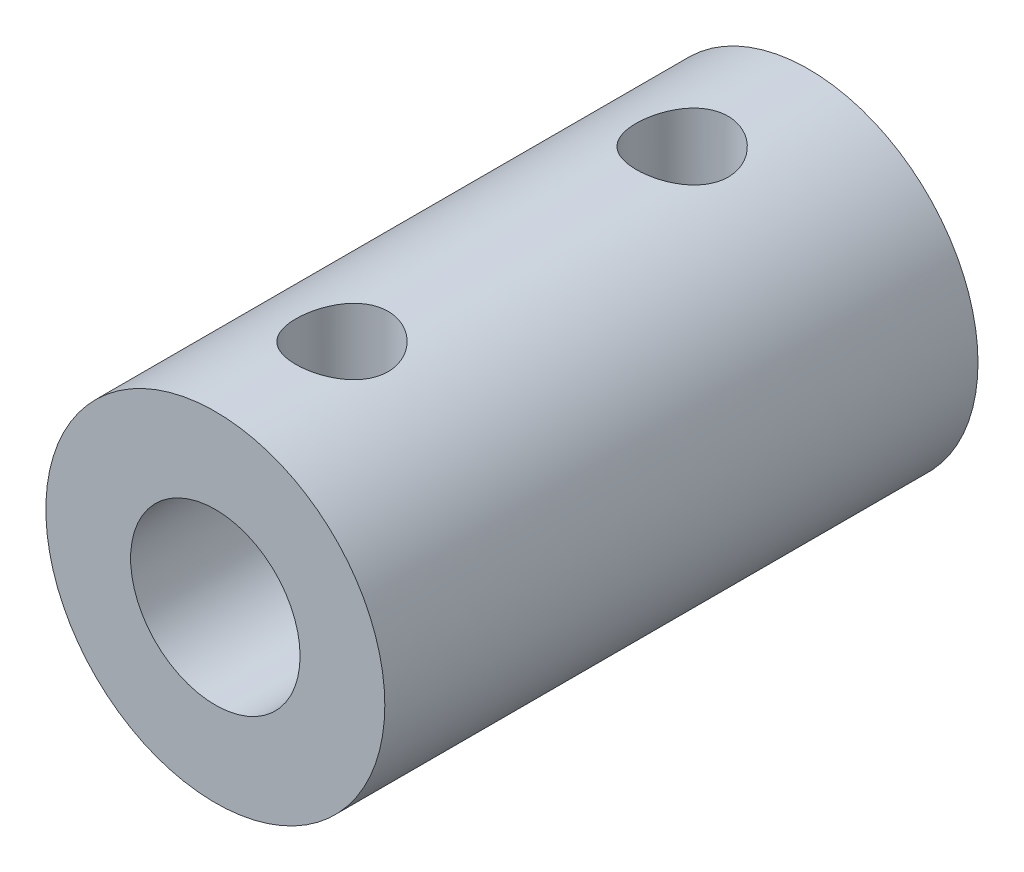
ISO-10303-21;
HEADER;
FILE_DESCRIPTION(('STEP AP214'),'2;1');
FILE_NAME('part.step','',(''),(''),'','','');
FILE_SCHEMA(('AUTOMOTIVE_DESIGN { 1 0 10303 214 1 1 1 1 }'));
ENDSEC;
DATA;
#1=APPLICATION_CONTEXT('core data for automotive mechanical design processes');
#2=APPLICATION_PROTOCOL_DEFINITION('international standard','automotive_design',2000,#1);
#3=PRODUCT_CONTEXT('',#1,'mechanical');
#4=PRODUCT('Part','Part','',(#3));
#5=PRODUCT_RELATED_PRODUCT_CATEGORY('part','',(#4));
#6=PRODUCT_DEFINITION_FORMATION('','',#4);
#7=PRODUCT_DEFINITION_CONTEXT('part definition',#1,'design');
#8=PRODUCT_DEFINITION('design','',#6,#7);
#9=PRODUCT_DEFINITION_SHAPE('','',#8);
#10=(LENGTH_UNIT() NAMED_UNIT(*) SI_UNIT(.MILLI.,.METRE.));
#11=(NAMED_UNIT(*) PLANE_ANGLE_UNIT() SI_UNIT($,.RADIAN.));
#12=(NAMED_UNIT(*) SI_UNIT($,.STERADIAN.) SOLID_ANGLE_UNIT());
#13=UNCERTAINTY_MEASURE_WITH_UNIT(LENGTH_MEASURE(1.E-05),#10,'distance_accuracy_value','');
#14=(GEOMETRIC_REPRESENTATION_CONTEXT(3) GLOBAL_UNCERTAINTY_ASSIGNED_CONTEXT((#13)) GLOBAL_UNIT_ASSIGNED_CONTEXT((#10,
#11,#12)) REPRESENTATION_CONTEXT('',''));
#15=CARTESIAN_POINT('',(0.,0.,0.));
#16=DIRECTION('',(0.,0.,1.));
#17=DIRECTION('',(1.,0.,0.));
#18=AXIS2_PLACEMENT_3D('',#15,#16,#17);
#19=CARTESIAN_POINT('',(0.,0.,22.225));
#20=DIRECTION('',(0.,0.,-1.));
#21=DIRECTION('',(-1.,0.,0.));
#22=AXIS2_PLACEMENT_3D('',#19,#20,#21);
#23=CYLINDRICAL_SURFACE('',#22,6.35);
#24=CARTESIAN_POINT('',(-1.74415507928932,6.10576965331884,17.4625));
#25=CARTESIAN_POINT('',(-1.74415294015703,6.10577123313325,17.3674284577655));
#26=CARTESIAN_POINT('',(-1.73628495695863,6.1080345239605,17.2723345348167));
#27=CARTESIAN_POINT('',(-1.70508323702834,6.11681659763782,17.0848981821488));
#28=CARTESIAN_POINT('',(-1.68174214778818,6.12333740355106,16.9925570823245));
#29=CARTESIAN_POINT('',(-1.62042086431407,6.13984813147446,16.8133651623767));
#30=CARTESIAN_POINT('',(-1.58246182034459,6.14983303932412,16.7265066200726));
#31=CARTESIAN_POINT('',(-1.49304666511393,6.17214925070533,16.5603804050019));
#32=CARTESIAN_POINT('',(-1.44158935107507,6.18448076330667,16.4811134095479));
#33=CARTESIAN_POINT('',(-1.32520352981619,6.21047218741606,16.3303578995175));
#34=CARTESIAN_POINT('',(-1.25998666512871,6.22415651988476,16.259096164451));
#35=CARTESIAN_POINT('',(-1.11854925756673,6.25112170803639,16.1283810792449));
#36=CARTESIAN_POINT('',(-1.04232753621755,6.26440252032305,16.0689289953849));
#37=CARTESIAN_POINT('',(-0.879463006344653,6.28935080737628,15.9625692349372));
#38=CARTESIAN_POINT('',(-0.792667279196146,6.300987597913,15.9158878961916));
#39=CARTESIAN_POINT('',(-0.612088846478514,6.32108276451823,15.8378723300576));
#40=CARTESIAN_POINT('',(-0.518307371907505,6.32954169899454,15.8065354060792));
#41=CARTESIAN_POINT('',(-0.328785161811779,6.34217640045183,15.7608346862393));
#42=CARTESIAN_POINT('',(-0.233144081342569,6.34644925676441,15.7460849141064));
#43=CARTESIAN_POINT('',(-0.0406545553170849,6.35059899504887,15.7327619063127));
#44=CARTESIAN_POINT('',(0.056193677387739,6.35047664134565,15.7341858580196));
#45=CARTESIAN_POINT('',(0.24565829208822,6.34593589511195,15.7529000073959));
#46=CARTESIAN_POINT('',(0.338319042579959,6.34163027244158,15.7697730515847));
#47=CARTESIAN_POINT('',(0.51945101677674,6.32936931428713,15.8182313557966));
#48=CARTESIAN_POINT('',(0.607921996536334,6.32141376657714,15.849817471317));
#49=CARTESIAN_POINT('',(0.779215251149414,6.30260505365105,15.927119217789));
#50=CARTESIAN_POINT('',(0.861970551792002,6.2917231043366,15.9729759601303));
#51=CARTESIAN_POINT('',(1.01875750709587,6.26824751559683,16.0774084842002));
#52=CARTESIAN_POINT('',(1.09278739768205,6.25565353114231,16.1359868311599));
#53=CARTESIAN_POINT('',(1.2325108050718,6.22965758580126,16.2664066554296));
#54=CARTESIAN_POINT('',(1.29786298931935,6.21624266620785,16.3386116667761));
#55=CARTESIAN_POINT('',(1.41561375879274,6.19049114815906,16.4930898873093));
#56=CARTESIAN_POINT('',(1.46801148682996,6.17815462109516,16.5753637622084));
#57=CARTESIAN_POINT('',(1.55863719890032,6.15592004886759,16.7484083218315));
#58=CARTESIAN_POINT('',(1.59676878377281,6.14603873946286,16.8392317988796));
#59=CARTESIAN_POINT('',(1.65709770241316,6.1300499257148,17.0263359521683));
#60=CARTESIAN_POINT('',(1.67929917222809,6.1239414418638,17.122615204878));
#61=CARTESIAN_POINT('',(1.70653964336872,6.11640559637245,17.3146965805924));
#62=CARTESIAN_POINT('',(1.71208974320032,6.11483888183383,17.4104208318607));
#63=CARTESIAN_POINT('',(1.70728066099863,6.11618339918588,17.6014296145391));
#64=CARTESIAN_POINT('',(1.69692325027692,6.11909413250989,17.6967141937221));
#65=CARTESIAN_POINT('',(1.66104520801374,6.12892808816301,17.882146878432));
#66=CARTESIAN_POINT('',(1.635835087284,6.13576907382831,17.9723598597757));
#67=CARTESIAN_POINT('',(1.57131960699209,6.1526058706512,18.1472792656851));
#68=CARTESIAN_POINT('',(1.53201235235506,6.16260210594668,18.2319849480962));
#69=CARTESIAN_POINT('',(1.43939369004808,6.18489751515275,18.3956129044187));
#70=CARTESIAN_POINT('',(1.38578405693559,6.19724390344623,18.4743597850867));
#71=CARTESIAN_POINT('',(1.26645274036601,6.22272549947527,18.6219330292905));
#72=CARTESIAN_POINT('',(1.2007286847128,6.23586086136418,18.6907574451383));
#73=CARTESIAN_POINT('',(1.05666768755968,6.26190556861521,18.8186693227853));
#74=CARTESIAN_POINT('',(0.978009624288813,6.27479608994583,18.8773997077894));
#75=CARTESIAN_POINT('',(0.811661552302276,6.298472263292,18.9808308667717));
#76=CARTESIAN_POINT('',(0.723972024562248,6.30925802730912,19.0255323873523));
#77=CARTESIAN_POINT('',(0.542669728911745,6.32741951415227,19.0992209519507));
#78=CARTESIAN_POINT('',(0.449107667042275,6.33482080929817,19.1283261362846));
#79=CARTESIAN_POINT('',(0.258191290701053,6.34546815392449,19.1703338741575));
#80=CARTESIAN_POINT('',(0.16083785862134,6.34871516437541,19.1832401748144));
#81=CARTESIAN_POINT('',(-0.0315666969252643,6.35062727375499,19.1922411873145));
#82=CARTESIAN_POINT('',(-0.126592283322449,6.34943513392035,19.1888586987469));
#83=CARTESIAN_POINT('',(-0.314657376033977,6.34289714735773,19.1665975149432));
#84=CARTESIAN_POINT('',(-0.40769696220342,6.33755146796392,19.1477194439778));
#85=CARTESIAN_POINT('',(-0.588494518781807,6.32331749363553,19.0953032896412));
#86=CARTESIAN_POINT('',(-0.67628656708008,6.31445578918089,19.0618750639996));
#87=CARTESIAN_POINT('',(-0.845058015947138,6.29409332100137,18.9814053612947));
#88=CARTESIAN_POINT('',(-0.926036429769152,6.28259217593006,18.9343619168476));
#89=CARTESIAN_POINT('',(-1.08130175142431,6.25776660403122,18.826488376609));
#90=CARTESIAN_POINT('',(-1.15534309950238,6.24440070229572,18.7653144197219));
#91=CARTESIAN_POINT('',(-1.29228502025197,6.21750591720152,18.6315634185813));
#92=CARTESIAN_POINT('',(-1.35518261662916,6.20397699132936,18.5589833376961));
#93=CARTESIAN_POINT('',(-1.46949902297096,6.17791203327205,18.4024605102873));
#94=CARTESIAN_POINT('',(-1.52061855731867,6.16540621829478,18.3182937079649));
#95=CARTESIAN_POINT('',(-1.60791768912795,6.14321925242848,18.1422283690047));
#96=CARTESIAN_POINT('',(-1.64410668099876,6.13353632648532,18.0503347381026));
#97=CARTESIAN_POINT('',(-1.69600282262268,6.1193690565194,17.8761202752871));
#98=CARTESIAN_POINT('',(-1.71401654666183,6.11431124936343,17.7945261216434));
#99=CARTESIAN_POINT('',(-1.73809286747036,6.10751106126085,17.6294602411976));
#100=CARTESIAN_POINT('',(-1.74415695780605,6.10576826597697,17.5459887503602));
#101=CARTESIAN_POINT('',(-1.74415507928932,6.10576965331884,17.4625));
#102=B_SPLINE_CURVE_WITH_KNOTS('',3,(#24,#25,#26,#27,#28,#29,#30,#31,#32,#33,#34,#35,#36,#37,
#38,#39,#40,#41,#42,#43,#44,#45,#46,#47,#48,#49,#50,#51,#52,#53,#54,#55,#56,#57,#58,#59,#60,#61,
#62,#63,#64,#65,#66,#67,#68,#69,#70,#71,#72,#73,#74,#75,#76,#77,#78,#79,#80,#81,#82,#83,#84,#85,
#86,#87,#88,#89,#90,#91,#92,#93,#94,#95,#96,#97,#98,#99,#100,#101),.UNSPECIFIED.,.T.,.F.,(4,2,2,
2,2,2,2,2,2,2,2,2,2,2,2,2,2,2,2,2,2,2,2,2,2,2,2,2,2,2,2,2,2,2,2,2,2,2,4),(0.,0.284907483795322,
0.569950447023162,0.854582530633478,1.13923998530775,1.4305920860604,1.72197540994495,
2.01823016220199,2.31443283266957,2.60359035057114,2.89269758436284,3.17422149638734,
3.45576177977405,3.74017954811614,4.02465472083983,4.31820614748809,4.6117769930633,
4.90729718589529,5.20274062296329,5.48901787200055,5.775263246192,6.05572669321374,
6.33622785702082,6.62310984645767,6.91004807173361,7.20565699731883,7.50125018821925,
7.79457145824388,8.08782486482188,8.37173002674299,8.6556237515334,8.93741020430449,
9.21923739524772,9.50882250475626,9.79848484099475,10.0948495083034,10.3910274153003,
10.641255220995,10.8914517491176),.UNSPECIFIED.);
#103=CARTESIAN_POINT('',(-1.74415507928932,6.10576965331884,17.4625));
#104=VERTEX_POINT('',#103);
#105=EDGE_CURVE('E107',#104,#104,#102,.T.);
#106=ORIENTED_EDGE('',*,*,#105,.T.);
#107=EDGE_LOOP('',(#106));
#108=FACE_BOUND('',#107,.T.);
#109=CARTESIAN_POINT('',(-1.70001586687602,6.11820611391687,4.7625));
#110=CARTESIAN_POINT('',(-1.70001371639064,6.11820767824203,4.66742845776545));
#111=CARTESIAN_POINT('',(-1.69212959366727,6.1204140902303,4.57233453481675));
#112=CARTESIAN_POINT('',(-1.66086526630538,6.1289706070035,4.38489818214883));
#113=CARTESIAN_POINT('',(-1.63747769474044,6.1353226817016,4.29255708232449));
#114=CARTESIAN_POINT('',(-1.57603877561068,6.15139013824081,4.11336516237671));
#115=CARTESIAN_POINT('',(-1.53800861396932,6.16110065879199,4.02650662007257));
#116=CARTESIAN_POINT('',(-1.44843463050231,6.18277056329537,3.86038040500195));
#117=CARTESIAN_POINT('',(-1.39688960442052,6.19473014762589,3.78111340954794));
#118=CARTESIAN_POINT('',(-1.28031911712485,6.21988039631233,3.63035789951748));
#119=CARTESIAN_POINT('',(-1.21500512960323,6.23309339857538,3.559096164451));
#120=CARTESIAN_POINT('',(-1.07337667707796,6.25903647212508,3.42838107924493));
#121=CARTESIAN_POINT('',(-0.997061033943764,6.27176649150605,3.36892899538489));
#122=CARTESIAN_POINT('',(-0.834020583204641,6.29553797737449,3.26256923493718));
#123=CARTESIAN_POINT('',(-0.747143082553263,6.30654765610746,3.21588789619164));
#124=CARTESIAN_POINT('',(-0.566424238422153,6.3253382244747,3.13787233005764));
#125=CARTESIAN_POINT('',(-0.472584121875812,6.33311968139204,3.10653540607917));
#126=CARTESIAN_POINT('',(-0.282975610456275,6.34438539032448,3.06083468623933));
#127=CARTESIAN_POINT('',(-0.187306166894769,6.34796744881334,3.04608491410639));
#128=CARTESIAN_POINT('',(0.00520830764368438,6.3507269869138,3.03276190631265));
#129=CARTESIAN_POINT('',(0.10205313129442,6.3499052323675,3.0341858580196));
#130=CARTESIAN_POINT('',(0.291480013749856,6.34399635741748,3.05290000739589));
#131=CARTESIAN_POINT('',(0.384107254278119,6.33902168351951,3.06977305158472));
#132=CARTESIAN_POINT('',(0.565145960847639,6.32545297337729,3.11823135579662));
#133=CARTESIAN_POINT('',(0.653557181417187,6.31685872667433,3.149817471317));
#134=CARTESIAN_POINT('',(0.824710139369087,6.29681348429136,3.22711921778902));
#135=CARTESIAN_POINT('',(0.90738469641831,6.28533418892786,3.27297596013029));
#136=CARTESIAN_POINT('',(1.06399803079042,6.26072695184226,3.3774084842002));
#137=CARTESIAN_POINT('',(1.13793504159252,6.24759867783949,3.43598683115992));
#138=CARTESIAN_POINT('',(1.27746707187424,6.2205943768443,3.56640665542959));
#139=CARTESIAN_POINT('',(1.34272067411533,6.20670785646716,3.6386116667761));
#140=CARTESIAN_POINT('',(1.46028240461751,6.18010665508966,3.7930898873093));
#141=CARTESIAN_POINT('',(1.51258967622789,6.16739205166925,3.87536376220845));
#142=CARTESIAN_POINT('',(1.60305245480392,6.14450359207259,4.04840832183152));
#143=CARTESIAN_POINT('',(1.64111168598245,6.13434716737986,4.13923179887965));
#144=CARTESIAN_POINT('',(1.70132356584273,6.11792309623186,4.32633595216835));
#145=CARTESIAN_POINT('',(1.72348034339003,6.11165444042535,4.42261520487799));
#146=CARTESIAN_POINT('',(1.75066568295766,6.10392207029543,4.61469658059239));
#147=CARTESIAN_POINT('',(1.75620432379839,6.10231531573307,4.71042083186068));
#148=CARTESIAN_POINT('',(1.75140507663415,6.10369452753305,4.90142961453912));
#149=CARTESIAN_POINT('',(1.74106895629412,6.10667998254995,4.9967141937221));
#150=CARTESIAN_POINT('',(1.70526286698828,6.11677278043003,5.18214687843204));
#151=CARTESIAN_POINT('',(1.68010280685279,6.12379564637348,5.27235985977574));
#152=CARTESIAN_POINT('',(1.61571059834855,6.14109791236661,5.44727926568507));
#153=CARTESIAN_POINT('',(1.57647655801732,6.1513777502287,5.53198494809625));
#154=CARTESIAN_POINT('',(1.48402132051711,6.1743414376064,5.69561290441875));
#155=CARTESIAN_POINT('',(1.430502246648,6.18707465395346,5.77435978508665));
#156=CARTESIAN_POINT('',(1.31135806098236,6.21341735450766,5.92193302929053));
#157=CARTESIAN_POINT('',(1.24573057816481,6.22702700999529,5.99075744513827));
#158=CARTESIAN_POINT('',(1.10186142337013,6.25411139618377,6.11866932278526));
#159=CARTESIAN_POINT('',(1.02329850205518,6.26756962237298,6.17739970778935));
#160=CARTESIAN_POINT('',(0.857125748872234,6.29244648587214,6.28083086677172));
#161=CARTESIAN_POINT('',(0.769516398776171,6.30386523170728,6.32553238735235));
#162=CARTESIAN_POINT('',(0.588349986746944,6.32333554667526,6.39922095195075));
#163=CARTESIAN_POINT('',(0.494843814206892,6.33141232127986,6.42832613628461));
#164=CARTESIAN_POINT('',(0.30400930768341,6.34343811949842,6.47033387415747));
#165=CARTESIAN_POINT('',(0.2066818630088,6.34738809768548,6.48324017481441));
#166=CARTESIAN_POINT('',(0.0142961332753003,6.35068963555053,6.49224118731446));
#167=CARTESIAN_POINT('',(-0.0807355844081238,6.35018376832272,6.48885869874691));
#168=CARTESIAN_POINT('',(-0.268842988099181,6.34500409251258,6.46659751494319));
#169=CARTESIAN_POINT('',(-0.361918752751403,6.34033045183675,6.44771944397781));
#170=CARTESIAN_POINT('',(-0.542814387550457,6.32740250534305,6.39530328964121));
#171=CARTESIAN_POINT('',(-0.63066814267085,6.31917503541033,6.36187506399961));
#172=CARTESIAN_POINT('',(-0.799582241194054,6.30003190653489,6.28140536129472));
#173=CARTESIAN_POINT('',(-0.880641600629775,6.28911585912976,6.23436191684764));
#174=CARTESIAN_POINT('',(-1.03608215510568,6.26541220639419,6.12648837660896));
#175=CARTESIAN_POINT('',(-1.11021809631137,6.25258135389071,6.06531441972193));
#176=CARTESIAN_POINT('',(-1.24735067082437,6.22667621673053,5.93156341858125));
#177=CARTESIAN_POINT('',(-1.31034432822196,6.2136018680677,5.85898333769606));
#178=CARTESIAN_POINT('',(-1.42484598559998,6.18836314276076,5.70246051028726));
#179=CARTESIAN_POINT('',(-1.47605449954946,6.17622682127281,5.61829370796493));
#180=CARTESIAN_POINT('',(-1.56351158140761,6.15467087773366,5.44222836900469));
#181=CARTESIAN_POINT('',(-1.59976955629937,6.14524954851774,5.35033473810264));
#182=CARTESIAN_POINT('',(-1.65176665572021,6.13145742375189,5.17612027528708));
#183=CARTESIAN_POINT('',(-1.66981643573804,6.12652983729467,5.09452612164342));
#184=CARTESIAN_POINT('',(-1.69394123729949,6.11990369727754,4.92946024119763));
#185=CARTESIAN_POINT('',(-1.70001775536265,6.11820474017717,4.84598875036021));
#186=CARTESIAN_POINT('',(-1.70001586687602,6.11820611391687,4.7625));
#187=B_SPLINE_CURVE_WITH_KNOTS('',3,(#109,#110,#111,#112,#113,#114,#115,#116,#117,#118,#119,
#120,#121,#122,#123,#124,#125,#126,#127,#128,#129,#130,#131,#132,#133,#134,#135,#136,#137,#138,
#139,#140,#141,#142,#143,#144,#145,#146,#147,#148,#149,#150,#151,#152,#153,#154,#155,#156,#157,
#158,#159,#160,#161,#162,#163,#164,#165,#166,#167,#168,#169,#170,#171,#172,#173,#174,#175,#176,
#177,#178,#179,#180,#181,#182,#183,#184,#185,#186),.UNSPECIFIED.,.T.,.F.,(4,2,2,2,2,2,2,2,2,2,2,
2,2,2,2,2,2,2,2,2,2,2,2,2,2,2,2,2,2,2,2,2,2,2,2,2,2,2,4),(0.,0.28490748379532,0.569950447023163,
0.854582530633477,1.13923998530775,1.4305920860604,1.72197540994495,2.01823016220199,
2.31443283266957,2.60359035057114,2.89269758436284,3.17422149638734,3.45576177977405,
3.74017954811614,4.02465472083983,4.31820614748809,4.6117769930633,4.90729718589529,
5.20274062296329,5.48901787200055,5.77526324619199,6.05572669321374,6.33622785702082,
6.62310984645767,6.91004807173361,7.20565699731883,7.50125018821925,7.79457145824389,
8.08782486482188,8.37173002674299,8.6556237515334,8.93741020430449,9.21923739524772,
9.50882250475626,9.79848484099474,10.0948495083034,10.3910274153003,10.641255220995,
10.8914517491176),.UNSPECIFIED.);
#188=CARTESIAN_POINT('',(-1.70001586687602,6.11820611391687,4.7625));
#189=VERTEX_POINT('',#188);
#190=EDGE_CURVE('E56',#189,#189,#187,.T.);
#191=ORIENTED_EDGE('',*,*,#190,.T.);
#192=EDGE_LOOP('',(#191));
#193=FACE_BOUND('',#192,.T.);
#194=CARTESIAN_POINT('',(0.,0.,22.225));
#195=DIRECTION('',(0.,0.,1.));
#196=DIRECTION('',(1.,0.,0.));
#197=AXIS2_PLACEMENT_3D('',#194,#195,#196);
#198=CIRCLE('',#197,6.35);
#199=CARTESIAN_POINT('',(6.35,0.,22.225));
#200=VERTEX_POINT('',#199);
#201=EDGE_CURVE('E10',#200,#200,#198,.T.);
#202=ORIENTED_EDGE('',*,*,#201,.F.);
#203=EDGE_LOOP('',(#202));
#204=FACE_BOUND('',#203,.T.);
#205=CARTESIAN_POINT('',(0.,0.,0.));
#206=DIRECTION('',(0.,0.,1.));
#207=DIRECTION('',(1.,0.,0.));
#208=AXIS2_PLACEMENT_3D('',#205,#206,#207);
#209=CIRCLE('',#208,6.35);
#210=CARTESIAN_POINT('',(6.35,0.,0.));
#211=VERTEX_POINT('',#210);
#212=EDGE_CURVE('E41',#211,#211,#209,.T.);
#213=ORIENTED_EDGE('',*,*,#212,.T.);
#214=EDGE_LOOP('',(#213));
#215=FACE_BOUND('',#214,.T.);
#216=ADVANCED_FACE('F33',(#108,#193,#204,#215),#23,.T.);
#217=CARTESIAN_POINT('',(0.,0.,22.225));
#218=DIRECTION('',(0.,0.,1.));
#219=DIRECTION('',(1.,0.,0.));
#220=AXIS2_PLACEMENT_3D('',#217,#218,#219);
#221=PLANE('',#220);
#222=CARTESIAN_POINT('',(0.,0.,22.225));
#223=DIRECTION('',(0.,0.,1.));
#224=DIRECTION('',(1.,0.,0.));
#225=AXIS2_PLACEMENT_3D('',#222,#223,#224);
#226=CIRCLE('',#225,3.175);
#227=CARTESIAN_POINT('',(3.175,0.,22.225));
#228=VERTEX_POINT('',#227);
#229=EDGE_CURVE('E48',#228,#228,#226,.T.);
#230=ORIENTED_EDGE('',*,*,#229,.F.);
#231=EDGE_LOOP('',(#230));
#232=FACE_BOUND('',#231,.T.);
#233=ORIENTED_EDGE('',*,*,#201,.T.);
#234=EDGE_LOOP('',(#233));
#235=FACE_BOUND('',#234,.T.);
#236=ADVANCED_FACE('F91',(#232,#235),#221,.T.);
#237=CARTESIAN_POINT('',(0.,0.,0.));
#238=DIRECTION('',(0.,0.,1.));
#239=DIRECTION('',(1.,0.,0.));
#240=AXIS2_PLACEMENT_3D('',#237,#238,#239);
#241=PLANE('',#240);
#242=CARTESIAN_POINT('',(0.,0.,0.));
#243=DIRECTION('',(0.,0.,-1.));
#244=DIRECTION('',(-1.,0.,0.));
#245=AXIS2_PLACEMENT_3D('',#242,#243,#244);
#246=CIRCLE('',#245,2.38125);
#247=CARTESIAN_POINT('',(-2.38125,0.,0.));
#248=VERTEX_POINT('',#247);
#249=EDGE_CURVE('E53',#248,#248,#246,.T.);
#250=ORIENTED_EDGE('',*,*,#249,.F.);
#251=EDGE_LOOP('',(#250));
#252=FACE_BOUND('',#251,.T.);
#253=ORIENTED_EDGE('',*,*,#212,.F.);
#254=EDGE_LOOP('',(#253));
#255=FACE_BOUND('',#254,.T.);
#256=ADVANCED_FACE('F89',(#252,#255),#241,.F.);
#257=CARTESIAN_POINT('',(0.,0.,9.525));
#258=DIRECTION('',(0.,0.,1.));
#259=DIRECTION('',(1.,0.,0.));
#260=AXIS2_PLACEMENT_3D('',#257,#258,#259);
#261=CYLINDRICAL_SURFACE('',#260,3.175);
#262=CARTESIAN_POINT('',(-1.73458832688403,2.65929094614291,17.4625));
#263=CARTESIAN_POINT('',(-1.73458158704274,2.65930026951297,17.551205430286));
#264=CARTESIAN_POINT('',(-1.72771997848496,2.66381021887089,17.6399929262913));
#265=CARTESIAN_POINT('',(-1.70067119306079,2.68115319646682,17.8147374408676));
#266=CARTESIAN_POINT('',(-1.68046092513612,2.69400064658216,17.9006892832124));
#267=CARTESIAN_POINT('',(-1.62791002490931,2.72607147602162,18.0668881753716));
#268=CARTESIAN_POINT('',(-1.59564357049751,2.74525578463139,18.1471666117636));
#269=CARTESIAN_POINT('',(-1.52012005410923,2.78778289530937,18.3011332055163));
#270=CARTESIAN_POINT('',(-1.4768608758495,2.81112649785237,18.3748200901957));
#271=CARTESIAN_POINT('',(-1.37558102941263,2.86215320554256,18.5215192476432));
#272=CARTESIAN_POINT('',(-1.31652476093878,2.89003721091982,18.5937469577089));
#273=CARTESIAN_POINT('',(-1.18745802452884,2.94542080178734,18.7278870100561));
#274=CARTESIAN_POINT('',(-1.11744119225242,2.97292015375556,18.7897933157301));
#275=CARTESIAN_POINT('',(-0.961314969126637,3.02718942562819,18.9066162913339));
#276=CARTESIAN_POINT('',(-0.874350192931502,3.05370690917051,18.9605183633151));
#277=CARTESIAN_POINT('',(-0.690870236457002,3.1003636986792,19.0525500959167));
#278=CARTESIAN_POINT('',(-0.594362243016947,3.12050775707133,19.0906915151944));
#279=CARTESIAN_POINT('',(-0.402879757310279,3.15070235914098,19.1468428345099));
#280=CARTESIAN_POINT('',(-0.308424424962534,3.16144321101555,19.1662431502612));
#281=CARTESIAN_POINT('',(-0.117045581780737,3.17428684234851,19.1889918149784));
#282=CARTESIAN_POINT('',(-0.0201239460452082,3.17639599792454,19.1923520128686));
#283=CARTESIAN_POINT('',(0.162764498372102,3.1720090359186,19.1833421524105));
#284=CARTESIAN_POINT('',(0.248835901475883,3.16637279256569,19.1725491294497));
#285=CARTESIAN_POINT('',(0.417740309423707,3.14854416299713,19.1384341926718));
#286=CARTESIAN_POINT('',(0.500573066039454,3.1363512752955,19.1151113205073));
#287=CARTESIAN_POINT('',(0.661886413384268,3.10633956903451,19.0565779899945));
#288=CARTESIAN_POINT('',(0.740307671655276,3.08845909916924,19.0212369545971));
#289=CARTESIAN_POINT('',(0.89027688207331,3.04861626448223,18.9399199947114));
#290=CARTESIAN_POINT('',(0.96182258403466,3.02665257018491,18.8939406052372));
#291=CARTESIAN_POINT('',(1.10414125015194,2.97787494802074,18.7870783952466));
#292=CARTESIAN_POINT('',(1.17402314441927,2.95079361781409,18.7251307377572));
#293=CARTESIAN_POINT('',(1.30293098555938,2.89618836148748,18.590885733176));
#294=CARTESIAN_POINT('',(1.3619459748293,2.86866401873074,18.5185780687946));
#295=CARTESIAN_POINT('',(1.47241571099279,2.81366990070018,18.3582763830214));
#296=CARTESIAN_POINT('',(1.52280725609596,2.78640206713028,18.2694725726425));
#297=CARTESIAN_POINT('',(1.60757434199672,2.73837946858329,18.082909033901));
#298=CARTESIAN_POINT('',(1.64196830928996,2.71761721932128,17.9851597653443));
#299=CARTESIAN_POINT('',(1.69078108250715,2.68749933004788,17.7916549941109));
#300=CARTESIAN_POINT('',(1.70659260848336,2.67735575757444,17.696379705005));
#301=CARTESIAN_POINT('',(1.72198794435648,2.66748618182628,17.5040319368808));
#302=CARTESIAN_POINT('',(1.7215892332805,2.66774895768091,17.4069615064363));
#303=CARTESIAN_POINT('',(1.7058514783456,2.67782491603267,17.2284481346197));
#304=CARTESIAN_POINT('',(1.69262211315251,2.68628935839047,17.1467278115004));
#305=CARTESIAN_POINT('',(1.65493864348563,2.70966625495678,16.98688177659));
#306=CARTESIAN_POINT('',(1.63047981497998,2.72458142271536,16.9087575928632));
#307=CARTESIAN_POINT('',(1.57000342606238,2.75988833024731,16.7544183831718));
#308=CARTESIAN_POINT('',(1.53353392004042,2.78048804856917,16.6784300344959));
#309=CARTESIAN_POINT('',(1.45045164032827,2.8247175833129,16.5331869437515));
#310=CARTESIAN_POINT('',(1.40383378731002,2.84834891463983,16.4639355988108));
#311=CARTESIAN_POINT('',(1.29341368234133,2.9003405510435,16.3229296748532));
#312=CARTESIAN_POINT('',(1.22806968532201,2.92886782517301,16.2524382443003));
#313=CARTESIAN_POINT('',(1.08622989212108,2.98438149128089,16.1229156398686));
#314=CARTESIAN_POINT('',(1.00972796785479,3.01136702510656,16.0638908054101));
#315=CARTESIAN_POINT('',(0.843081163595059,3.06231500498008,15.9564119609784));
#316=CARTESIAN_POINT('',(0.752462684028091,3.08607456711372,15.9085886083334));
#317=CARTESIAN_POINT('',(0.562810997508235,3.12621609037799,15.8293611191999));
#318=CARTESIAN_POINT('',(0.463786511853437,3.14260558943642,15.7979402013681));
#319=CARTESIAN_POINT('',(0.27089033170025,3.16475949394835,15.7555303914918));
#320=CARTESIAN_POINT('',(0.177505669879459,3.17142852034753,15.7428009396212));
#321=CARTESIAN_POINT('',(-0.0102946618404546,3.17636956212057,15.7327473586983));
#322=CARTESIAN_POINT('',(-0.10470979076308,3.17464579019679,15.7354155010634));
#323=CARTESIAN_POINT('',(-0.283230008129362,3.16349779754913,15.7550849290071));
#324=CARTESIAN_POINT('',(-0.367521400886871,3.15475133426993,15.7708287073506));
#325=CARTESIAN_POINT('',(-0.532051846693672,3.13120666536975,15.8142998205854));
#326=CARTESIAN_POINT('',(-0.612290404570487,3.11640772226085,15.8420286158611));
#327=CARTESIAN_POINT('',(-0.76971042547109,3.08138075510974,15.9096084689243));
#328=CARTESIAN_POINT('',(-0.846681967196827,3.06097851218013,15.9498552392567));
#329=CARTESIAN_POINT('',(-0.99303192762314,3.01668162925034,16.0408396373495));
#330=CARTESIAN_POINT('',(-1.06240717842155,2.99278554183067,16.0915816166639));
#331=CARTESIAN_POINT('',(-1.19994176439596,2.94053889574538,16.2087204638391));
#332=CARTESIAN_POINT('',(-1.26707137753178,2.91199047624866,16.2762400036137));
#333=CARTESIAN_POINT('',(-1.38954626780355,2.85558117121522,16.4216267416461));
#334=CARTESIAN_POINT('',(-1.44487766540845,2.82772112917091,16.4995059542064));
#335=CARTESIAN_POINT('',(-1.54541751151634,2.77412200204178,16.6693984534211));
#336=CARTESIAN_POINT('',(-1.58978861700495,2.74862053435996,16.7619878982551));
#337=CARTESIAN_POINT('',(-1.6616959946731,2.7057673854706,16.9551064338918));
#338=CARTESIAN_POINT('',(-1.68928650985469,2.68838948755761,17.0556087436623));
#339=CARTESIAN_POINT('',(-1.71656735328935,2.67097737097831,17.2082741939605));
#340=CARTESIAN_POINT('',(-1.72330941302886,2.66661928263169,17.2587735158261));
#341=CARTESIAN_POINT('',(-1.73232185068912,2.66077337881312,17.3603394811527));
#342=CARTESIAN_POINT('',(-1.73459220899804,2.65928557592958,17.4114061271007));
#343=CARTESIAN_POINT('',(-1.73458832688403,2.65929094614291,17.4625));
#344=B_SPLINE_CURVE_WITH_KNOTS('',3,(#262,#263,#264,#265,#266,#267,#268,#269,#270,#271,#272,
#273,#274,#275,#276,#277,#278,#279,#280,#281,#282,#283,#284,#285,#286,#287,#288,#289,#290,#291,
#292,#293,#294,#295,#296,#297,#298,#299,#300,#301,#302,#303,#304,#305,#306,#307,#308,#309,#310,
#311,#312,#313,#314,#315,#316,#317,#318,#319,#320,#321,#322,#323,#324,#325,#326,#327,#328,#329,
#330,#331,#332,#333,#334,#335,#336,#337,#338,#339,#340,#341,#342,#343),.UNSPECIFIED.,.T.,.F.,(4,
2,2,2,2,2,2,2,2,2,2,2,2,2,2,2,2,2,2,2,2,2,2,2,2,2,2,2,2,2,2,2,2,2,2,2,2,2,2,2,4),(0.,
0.265899705046178,0.532260583208826,0.797008913916029,1.06180825177107,1.35274578453463,
1.64385288348847,1.95925628748717,2.27442394959216,2.56383650946082,2.85303524554435,
3.11259135724205,3.37216732395412,3.63465880324002,3.89723589847811,4.18773288263561,
4.47852120319196,4.79393052256275,5.10897563871009,5.39849355188671,5.68769929460694,
5.93621992285324,6.18484519515881,6.44416515424852,6.70361520467188,7.00310702596158,
7.3027639559545,7.61656871218808,7.93005178218817,8.2119297932403,8.49366633232291,
8.75107595365827,9.00851694941735,9.27510514985789,9.54180410624687,9.83874203528056,
10.1360273808013,10.4516923365675,10.7663314105379,10.919487605213,11.0726444715939),.UNSPECIFIED.);
#345=CARTESIAN_POINT('',(-1.73458832688403,2.65929094614291,17.4625));
#346=VERTEX_POINT('',#345);
#347=EDGE_CURVE('E114',#346,#346,#344,.T.);
#348=ORIENTED_EDGE('',*,*,#347,.T.);
#349=EDGE_LOOP('',(#348));
#350=FACE_BOUND('',#349,.T.);
#351=CARTESIAN_POINT('',(0.,0.,9.525));
#352=DIRECTION('',(0.,0.,1.));
#353=DIRECTION('',(1.,0.,0.));
#354=AXIS2_PLACEMENT_3D('',#351,#352,#353);
#355=CIRCLE('',#354,3.175);
#356=CARTESIAN_POINT('',(3.175,0.,9.525));
#357=VERTEX_POINT('',#356);
#358=EDGE_CURVE('E46',#357,#357,#355,.T.);
#359=ORIENTED_EDGE('',*,*,#358,.F.);
#360=EDGE_LOOP('',(#359));
#361=FACE_BOUND('',#360,.T.);
#362=ORIENTED_EDGE('',*,*,#229,.T.);
#363=EDGE_LOOP('',(#362));
#364=FACE_BOUND('',#363,.T.);
#365=ADVANCED_FACE('F85',(#350,#361,#364),#261,.F.);
#366=CARTESIAN_POINT('',(0.,0.,9.525));
#367=DIRECTION('',(0.,0.,1.));
#368=DIRECTION('',(1.,0.,0.));
#369=AXIS2_PLACEMENT_3D('',#366,#367,#368);
#370=PLANE('',#369);
#371=CARTESIAN_POINT('',(0.,0.,9.525));
#372=DIRECTION('',(0.,0.,1.));
#373=DIRECTION('',(1.,0.,0.));
#374=AXIS2_PLACEMENT_3D('',#371,#372,#373);
#375=CIRCLE('',#374,2.38125);
#376=CARTESIAN_POINT('',(2.38125,0.,9.525));
#377=VERTEX_POINT('',#376);
#378=EDGE_CURVE('E37',#377,#377,#375,.T.);
#379=ORIENTED_EDGE('',*,*,#378,.F.);
#380=EDGE_LOOP('',(#379));
#381=FACE_BOUND('',#380,.T.);
#382=ORIENTED_EDGE('',*,*,#358,.T.);
#383=EDGE_LOOP('',(#382));
#384=FACE_BOUND('',#383,.T.);
#385=ADVANCED_FACE('F81',(#381,#384),#370,.T.);
#386=CARTESIAN_POINT('',(0.,0.,12.7));
#387=DIRECTION('',(0.,0.,-1.));
#388=DIRECTION('',(-1.,0.,0.));
#389=AXIS2_PLACEMENT_3D('',#386,#387,#388);
#390=CYLINDRICAL_SURFACE('',#389,2.38125);
#391=CARTESIAN_POINT('',(-1.71989499986887,1.64691006188136,4.7625));
#392=CARTESIAN_POINT('',(-1.71988476439153,1.64692986807784,4.844194856959));
#393=CARTESIAN_POINT('',(-1.71400181991881,1.65313252368208,4.9260068149276));
#394=CARTESIAN_POINT('',(-1.69105708539883,1.67657916315744,5.08648731955607));
#395=CARTESIAN_POINT('',(-1.67396014926862,1.6938578568712,5.16514515561611));
#396=CARTESIAN_POINT('',(-1.6301711576576,1.73602886864742,5.31631276918079));
#397=CARTESIAN_POINT('',(-1.60360238219973,1.76082277904473,5.38888738613314));
#398=CARTESIAN_POINT('',(-1.54194601814961,1.81505914169437,5.52835271082935));
#399=CARTESIAN_POINT('',(-1.50685912561274,1.84450121405483,5.59524388239164));
#400=CARTESIAN_POINT('',(-1.42137678445373,1.91141801615431,5.73547424548014));
#401=CARTESIAN_POINT('',(-1.36933617162827,1.9493507858438,5.80759218969477));
#402=CARTESIAN_POINT('',(-1.25474467672795,2.02501784140534,5.94320445709748));
#403=CARTESIAN_POINT('',(-1.19217961301844,2.0627517876466,6.00668693244685));
#404=CARTESIAN_POINT('',(-1.04446404850734,2.14189224650761,6.13493425543303));
#405=CARTESIAN_POINT('',(-0.957276438437359,2.18268846304419,6.19776737434501));
#406=CARTESIAN_POINT('',(-0.770063474638601,2.25552100979083,6.3072795371254));
#407=CARTESIAN_POINT('',(-0.670066585853181,2.28757628442676,6.35399357553028));
#408=CARTESIAN_POINT('',(-0.490118033863863,2.33154829166967,6.41751250884445));
#409=CARTESIAN_POINT('',(-0.412589372500548,2.34660150337351,6.4390483661536));
#410=CARTESIAN_POINT('',(-0.254227224121681,2.36898561911425,6.4711908995829));
#411=CARTESIAN_POINT('',(-0.17339656276505,2.37632298784254,6.48180672484993));
#412=CARTESIAN_POINT('',(-0.010529374533327,2.38262411590372,6.49150022215947));
#413=CARTESIAN_POINT('',(0.0715094645510145,2.38156891536474,6.4905517664579));
#414=CARTESIAN_POINT('',(0.234100295999645,2.37111547625318,6.47711468902542));
#415=CARTESIAN_POINT('',(0.314651897411154,2.36171507496133,6.4646230757672));
#416=CARTESIAN_POINT('',(0.469737964035623,2.33574630747175,6.42934643056826));
#417=CARTESIAN_POINT('',(0.544378472216438,2.31938976992636,6.40686477333891));
#418=CARTESIAN_POINT('',(0.688592374739363,2.28073948298061,6.35274590959894));
#419=CARTESIAN_POINT('',(0.75816473886568,2.25844453072705,6.32110684810138));
#420=CARTESIAN_POINT('',(0.898650988241581,2.20657837989891,6.24582515825035));
#421=CARTESIAN_POINT('',(0.968860565184288,2.17647487405327,6.20124137000632));
#422=CARTESIAN_POINT('',(1.10115870934734,2.11263068219797,6.1034287551257));
#423=CARTESIAN_POINT('',(1.16323923775066,2.07888645511826,6.05019148590841));
#424=CARTESIAN_POINT('',(1.28977354960786,2.00330571778552,5.92525219175738));
#425=CARTESIAN_POINT('',(1.35246667821001,1.96114329449384,5.85196136518389));
#426=CARTESIAN_POINT('',(1.46519842752194,1.87841001282726,5.69534027156727));
#427=CARTESIAN_POINT('',(1.51523560193076,1.83783933680171,5.61200885870805));
#428=CARTESIAN_POINT('',(1.59203796553748,1.77137223148255,5.45501750717409));
#429=CARTESIAN_POINT('',(1.62149912811142,1.74420626697518,5.38322148729749));
#430=CARTESIAN_POINT('',(1.67092428895455,1.69692062272925,5.2342745968226));
#431=CARTESIAN_POINT('',(1.69090955695723,1.67678518921562,5.15713616858255));
#432=CARTESIAN_POINT('',(1.71782407006147,1.64916584146169,5.0116045449247));
#433=CARTESIAN_POINT('',(1.7263362359927,1.64016795140183,4.94380029710017));
#434=CARTESIAN_POINT('',(1.73524681846874,1.63074155474198,4.80708495190806));
#435=CARTESIAN_POINT('',(1.73565184849423,1.63030606328112,4.73817480262641));
#436=CARTESIAN_POINT('',(1.72833320392419,1.63805955596936,4.6014038150579));
#437=CARTESIAN_POINT('',(1.72062085010952,1.64623652889255,4.53354164897876));
#438=CARTESIAN_POINT('',(1.6976167423803,1.66994470723263,4.40041121438565));
#439=CARTESIAN_POINT('',(1.68231334560605,1.6854872079829,4.33514709728864));
#440=CARTESIAN_POINT('',(1.63726144033036,1.72947034582891,4.18247348210811));
#441=CARTESIAN_POINT('',(1.6041706728111,1.76058567557554,4.09683227805378));
#442=CARTESIAN_POINT('',(1.52616881052452,1.82861771450712,3.93361246175521));
#443=CARTESIAN_POINT('',(1.48123414394998,1.8655459328392,3.8560503629387));
#444=CARTESIAN_POINT('',(1.37903733852409,1.94237436453491,3.70720204152815));
#445=CARTESIAN_POINT('',(1.32145203835664,1.98232999994591,3.63616689416703));
#446=CARTESIAN_POINT('',(1.19537233546841,2.06081250572394,3.50372146615582));
#447=CARTESIAN_POINT('',(1.12688728613986,2.09934056650059,3.44230302197555));
#448=CARTESIAN_POINT('',(0.98311949365337,2.17023718806618,3.33304168815472));
#449=CARTESIAN_POINT('',(0.908340132200381,2.20281608338052,3.28467780168509));
#450=CARTESIAN_POINT('',(0.750184220137395,2.26156553456338,3.19932342478749));
#451=CARTESIAN_POINT('',(0.666810241080121,2.2877379994046,3.16232954551024));
#452=CARTESIAN_POINT('',(0.49241489122643,2.33152640905083,3.10133718556359));
#453=CARTESIAN_POINT('',(0.401336346765689,2.34907032877739,3.07744790869585));
#454=CARTESIAN_POINT('',(0.215123391467978,2.37336375894811,3.04486065927312));
#455=CARTESIAN_POINT('',(0.119993448674755,2.38012486002682,3.03614637393494));
#456=CARTESIAN_POINT('',(-0.0569918347039227,2.38197662695085,3.03468151847449));
#457=CARTESIAN_POINT('',(-0.138823809848182,2.37858114286801,3.03984952823656));
#458=CARTESIAN_POINT('',(-0.300196169165759,2.36364066849611,3.06152838522731));
#459=CARTESIAN_POINT('',(-0.379736437051551,2.35209526541311,3.07803980699941));
#460=CARTESIAN_POINT('',(-0.532966963340721,2.32212986404129,3.12107613571251));
#461=CARTESIAN_POINT('',(-0.606739310616186,2.30384375598407,3.14740612799917));
#462=CARTESIAN_POINT('',(-0.748721893990579,2.26169358095479,3.2089659288577));
#463=CARTESIAN_POINT('',(-0.816931225139308,2.23782860888608,3.24419718161597));
#464=CARTESIAN_POINT('',(-0.955663593145622,2.18251084012124,3.32768660927002));
#465=CARTESIAN_POINT('',(-1.025280263349,2.15047042674562,3.37705588755621));
#466=CARTESIAN_POINT('',(-1.15575870937649,2.08326023060077,3.48456605946497));
#467=CARTESIAN_POINT('',(-1.21660821654776,2.04808617185897,3.54271901632184));
#468=CARTESIAN_POINT('',(-1.3397214971771,1.97021424025509,3.67863496360014));
#469=CARTESIAN_POINT('',(-1.40008668194664,1.92734875723275,3.75802781023211));
#470=CARTESIAN_POINT('',(-1.5069460798218,1.84499359065671,3.92729388421128));
#471=CARTESIAN_POINT('',(-1.55345011349728,1.80550153126623,4.01715962846056));
#472=CARTESIAN_POINT('',(-1.61949669745959,1.74612317405075,4.17895420498575));
#473=CARTESIAN_POINT('',(-1.6429465878089,1.72388333449295,4.24841785801306));
#474=CARTESIAN_POINT('',(-1.68101525343107,1.68678871786621,4.3915166726506));
#475=CARTESIAN_POINT('',(-1.69566337592245,1.67190942861011,4.46513706617164));
#476=CARTESIAN_POINT('',(-1.71022295821721,1.65696477507476,4.57665896766555));
#477=CARTESIAN_POINT('',(-1.7138401129806,1.65321445879698,4.61362341228969));
#478=CARTESIAN_POINT('',(-1.71867877383688,1.64818226691085,4.68788370452281));
#479=CARTESIAN_POINT('',(-1.71989967570504,1.6469010138881,4.72517963333598));
#480=CARTESIAN_POINT('',(-1.71989499986887,1.64691006188136,4.7625));
#481=B_SPLINE_CURVE_WITH_KNOTS('',3,(#391,#392,#393,#394,#395,#396,#397,#398,#399,#400,#401,
#402,#403,#404,#405,#406,#407,#408,#409,#410,#411,#412,#413,#414,#415,#416,#417,#418,#419,#420,
#421,#422,#423,#424,#425,#426,#427,#428,#429,#430,#431,#432,#433,#434,#435,#436,#437,#438,#439,
#440,#441,#442,#443,#444,#445,#446,#447,#448,#449,#450,#451,#452,#453,#454,#455,#456,#457,#458,
#459,#460,#461,#462,#463,#464,#465,#466,#467,#468,#469,#470,#471,#472,#473,#474,#475,#476,#477,
#478,#479,#480),.UNSPECIFIED.,.T.,.F.,(4,2,2,2,2,2,2,2,2,2,2,2,2,2,2,2,2,2,2,2,2,2,2,2,2,2,2,2,
2,2,2,2,2,2,2,2,2,2,2,2,2,2,2,2,4),(0.,0.244894831513921,0.490560885970521,0.733139702963829,
0.975698704369832,1.26474560661381,1.55418516446696,1.89712252843903,2.23931062044473,
2.48384888903575,2.7281821084737,2.97306746397283,3.21801630181992,3.4559870810325,
3.6940060990248,3.95837789882503,4.22300919267528,4.53755056275269,4.8521278618595,
5.09798523496482,5.34328810941091,5.54913650251978,5.75481696580463,5.96021095969965,
6.16592095789909,6.4551588347546,6.74497675919085,7.04330256666285,7.34137373884286,
7.62471036387209,7.90796245787753,8.1935404272197,8.47881121655918,8.72377886637898,
8.96875892471664,9.20911434718249,9.44950879122178,9.72198988407675,9.99484865509036,
10.3191800511927,10.6432811105953,10.8723663536282,11.1006834704708,11.212529693665,
11.3244041157086),.UNSPECIFIED.);
#482=CARTESIAN_POINT('',(-1.71989499986887,1.64691006188136,4.7625));
#483=VERTEX_POINT('',#482);
#484=EDGE_CURVE('E62',#483,#483,#481,.T.);
#485=ORIENTED_EDGE('',*,*,#484,.T.);
#486=EDGE_LOOP('',(#485));
#487=FACE_BOUND('',#486,.T.);
#488=ORIENTED_EDGE('',*,*,#378,.T.);
#489=EDGE_LOOP('',(#488));
#490=FACE_BOUND('',#489,.T.);
#491=ORIENTED_EDGE('',*,*,#249,.T.);
#492=EDGE_LOOP('',(#491));
#493=FACE_BOUND('',#492,.T.);
#494=ADVANCED_FACE('F72',(#487,#490,#493),#390,.F.);
#495=CARTESIAN_POINT('',(0.0282314670001296,6.34993724254587,4.7625));
#496=DIRECTION('',(0.00444590031498101,0.999990116936357,0.));
#497=DIRECTION('',(-0.999990116936357,0.00444590031498101,0.));
#498=AXIS2_PLACEMENT_3D('',#495,#496,#497);
#499=CYLINDRICAL_SURFACE('',#498,1.72719999999999);
#500=ORIENTED_EDGE('',*,*,#484,.F.);
#501=EDGE_LOOP('',(#500));
#502=FACE_BOUND('',#501,.T.);
#503=ORIENTED_EDGE('',*,*,#190,.F.);
#504=EDGE_LOOP('',(#503));
#505=FACE_BOUND('',#504,.T.);
#506=ADVANCED_FACE('F67',(#502,#505),#499,.F.);
#507=CARTESIAN_POINT('',(-0.0176262930656279,6.34997553647199,17.4625));
#508=DIRECTION('',(-0.0027757941835634,0.999996147475904,0.));
#509=DIRECTION('',(-0.999996147475904,-0.0027757941835634,0.));
#510=AXIS2_PLACEMENT_3D('',#507,#508,#509);
#511=CYLINDRICAL_SURFACE('',#510,1.72719999999999);
#512=ORIENTED_EDGE('',*,*,#347,.F.);
#513=EDGE_LOOP('',(#512));
#514=FACE_BOUND('',#513,.T.);
#515=ORIENTED_EDGE('',*,*,#105,.F.);
#516=EDGE_LOOP('',(#515));
#517=FACE_BOUND('',#516,.T.);
#518=ADVANCED_FACE('F71',(#514,#517),#511,.F.);
#519=CLOSED_SHELL('',(#216,#236,#256,#365,#385,#494,#506,#518));
#520=MANIFOLD_SOLID_BREP('B2',#519);
#521=ADVANCED_BREP_SHAPE_REPRESENTATION('',(#18,#520),#14);
#522=SHAPE_DEFINITION_REPRESENTATION(#9,#521);
ENDSEC;
END-ISO-10303-21;
